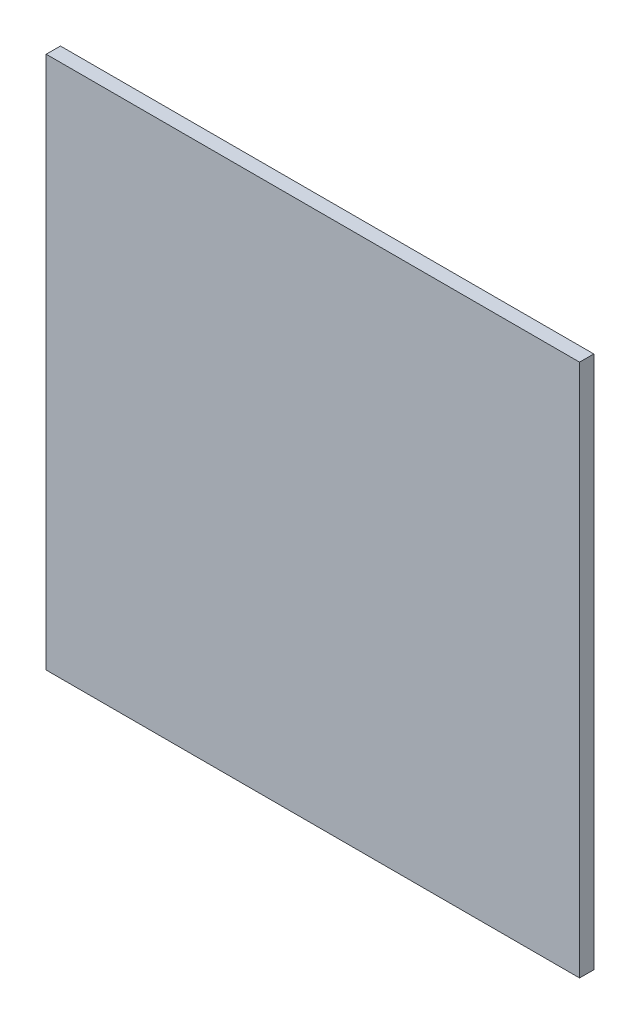
ISO-10303-21;
HEADER;
FILE_DESCRIPTION(('STEP AP214'),'2;1');
FILE_NAME('part.step','',(''),(''),'','','');
FILE_SCHEMA(('AUTOMOTIVE_DESIGN { 1 0 10303 214 1 1 1 1 }'));
ENDSEC;
DATA;
#1=APPLICATION_CONTEXT('core data for automotive mechanical design processes');
#2=APPLICATION_PROTOCOL_DEFINITION('international standard','automotive_design',2000,#1);
#3=PRODUCT_CONTEXT('',#1,'mechanical');
#4=PRODUCT('Part','Part','',(#3));
#5=PRODUCT_RELATED_PRODUCT_CATEGORY('part','',(#4));
#6=PRODUCT_DEFINITION_FORMATION('','',#4);
#7=PRODUCT_DEFINITION_CONTEXT('part definition',#1,'design');
#8=PRODUCT_DEFINITION('design','',#6,#7);
#9=PRODUCT_DEFINITION_SHAPE('','',#8);
#10=(LENGTH_UNIT() NAMED_UNIT(*) SI_UNIT(.MILLI.,.METRE.));
#11=(NAMED_UNIT(*) PLANE_ANGLE_UNIT() SI_UNIT($,.RADIAN.));
#12=(NAMED_UNIT(*) SI_UNIT($,.STERADIAN.) SOLID_ANGLE_UNIT());
#13=UNCERTAINTY_MEASURE_WITH_UNIT(LENGTH_MEASURE(1.E-05),#10,'distance_accuracy_value','');
#14=(GEOMETRIC_REPRESENTATION_CONTEXT(3) GLOBAL_UNCERTAINTY_ASSIGNED_CONTEXT((#13)) GLOBAL_UNIT_ASSIGNED_CONTEXT((#10,
#11,#12)) REPRESENTATION_CONTEXT('',''));
#15=CARTESIAN_POINT('',(0.,0.,0.));
#16=DIRECTION('',(0.,0.,1.));
#17=DIRECTION('',(1.,0.,0.));
#18=AXIS2_PLACEMENT_3D('',#15,#16,#17);
#19=CARTESIAN_POINT('',(15.,-15.,0.8));
#20=DIRECTION('',(-1.,0.,0.));
#21=DIRECTION('',(0.,0.,1.));
#22=AXIS2_PLACEMENT_3D('',#19,#20,#21);
#23=PLANE('',#22);
#24=DIRECTION('',(0.,1.,0.));
#25=VECTOR('',#24,1.);
#26=CARTESIAN_POINT('',(15.,-15.,0.));
#27=LINE('',#26,#25);
#28=CARTESIAN_POINT('',(15.,-15.,0.));
#29=VERTEX_POINT('',#28);
#30=CARTESIAN_POINT('',(15.,15.,0.));
#31=VERTEX_POINT('',#30);
#32=EDGE_CURVE('E100',#29,#31,#27,.T.);
#33=ORIENTED_EDGE('',*,*,#32,.T.);
#34=DIRECTION('',(0.,0.,-1.));
#35=VECTOR('',#34,1.);
#36=CARTESIAN_POINT('',(15.,15.,0.8));
#37=LINE('',#36,#35);
#38=CARTESIAN_POINT('',(15.,15.,0.8));
#39=VERTEX_POINT('',#38);
#40=EDGE_CURVE('E11',#39,#31,#37,.T.);
#41=ORIENTED_EDGE('',*,*,#40,.F.);
#42=DIRECTION('',(0.,1.,0.));
#43=VECTOR('',#42,1.);
#44=CARTESIAN_POINT('',(15.,-15.,0.8));
#45=LINE('',#44,#43);
#46=CARTESIAN_POINT('',(15.,-15.,0.8));
#47=VERTEX_POINT('',#46);
#48=EDGE_CURVE('E88',#47,#39,#45,.T.);
#49=ORIENTED_EDGE('',*,*,#48,.F.);
#50=DIRECTION('',(0.,0.,-1.));
#51=VECTOR('',#50,1.);
#52=CARTESIAN_POINT('',(15.,-15.,0.8));
#53=LINE('',#52,#51);
#54=EDGE_CURVE('E96',#47,#29,#53,.T.);
#55=ORIENTED_EDGE('',*,*,#54,.T.);
#56=EDGE_LOOP('',(#33,#41,#49,#55));
#57=FACE_BOUND('',#56,.T.);
#58=ADVANCED_FACE('F37',(#57),#23,.F.);
#59=CARTESIAN_POINT('',(-15.,15.,0.8));
#60=DIRECTION('',(0.,-1.,0.));
#61=DIRECTION('',(0.,0.,-1.));
#62=AXIS2_PLACEMENT_3D('',#59,#60,#61);
#63=PLANE('',#62);
#64=DIRECTION('',(-1.,0.,0.));
#65=VECTOR('',#64,1.);
#66=CARTESIAN_POINT('',(-15.,15.,0.));
#67=LINE('',#66,#65);
#68=CARTESIAN_POINT('',(-15.,15.,0.));
#69=VERTEX_POINT('',#68);
#70=EDGE_CURVE('E92',#31,#69,#67,.T.);
#71=ORIENTED_EDGE('',*,*,#70,.T.);
#72=DIRECTION('',(0.,0.,-1.));
#73=VECTOR('',#72,1.);
#74=CARTESIAN_POINT('',(-15.,15.,0.8));
#75=LINE('',#74,#73);
#76=CARTESIAN_POINT('',(-15.,15.,0.8));
#77=VERTEX_POINT('',#76);
#78=EDGE_CURVE('E45',#77,#69,#75,.T.);
#79=ORIENTED_EDGE('',*,*,#78,.F.);
#80=DIRECTION('',(-1.,0.,0.));
#81=VECTOR('',#80,1.);
#82=CARTESIAN_POINT('',(-15.,15.,0.8));
#83=LINE('',#82,#81);
#84=EDGE_CURVE('E83',#39,#77,#83,.T.);
#85=ORIENTED_EDGE('',*,*,#84,.F.);
#86=ORIENTED_EDGE('',*,*,#40,.T.);
#87=EDGE_LOOP('',(#71,#79,#85,#86));
#88=FACE_BOUND('',#87,.T.);
#89=ADVANCED_FACE('F91',(#88),#63,.F.);
#90=CARTESIAN_POINT('',(-15.,-15.,0.8));
#91=DIRECTION('',(1.,0.,0.));
#92=DIRECTION('',(0.,0.,-1.));
#93=AXIS2_PLACEMENT_3D('',#90,#91,#92);
#94=PLANE('',#93);
#95=DIRECTION('',(0.,-1.,0.));
#96=VECTOR('',#95,1.);
#97=CARTESIAN_POINT('',(-15.,-15.,0.));
#98=LINE('',#97,#96);
#99=CARTESIAN_POINT('',(-15.,-15.,0.));
#100=VERTEX_POINT('',#99);
#101=EDGE_CURVE('E70',#69,#100,#98,.T.);
#102=ORIENTED_EDGE('',*,*,#101,.T.);
#103=DIRECTION('',(0.,0.,-1.));
#104=VECTOR('',#103,1.);
#105=CARTESIAN_POINT('',(-15.,-15.,0.8));
#106=LINE('',#105,#104);
#107=CARTESIAN_POINT('',(-15.,-15.,0.8));
#108=VERTEX_POINT('',#107);
#109=EDGE_CURVE('E93',#108,#100,#106,.T.);
#110=ORIENTED_EDGE('',*,*,#109,.F.);
#111=DIRECTION('',(0.,-1.,0.));
#112=VECTOR('',#111,1.);
#113=CARTESIAN_POINT('',(-15.,-15.,0.8));
#114=LINE('',#113,#112);
#115=EDGE_CURVE('E86',#77,#108,#114,.T.);
#116=ORIENTED_EDGE('',*,*,#115,.F.);
#117=ORIENTED_EDGE('',*,*,#78,.T.);
#118=EDGE_LOOP('',(#102,#110,#116,#117));
#119=FACE_BOUND('',#118,.T.);
#120=ADVANCED_FACE('F94',(#119),#94,.F.);
#121=CARTESIAN_POINT('',(-15.,-15.,0.8));
#122=DIRECTION('',(0.,1.,0.));
#123=DIRECTION('',(0.,0.,1.));
#124=AXIS2_PLACEMENT_3D('',#121,#122,#123);
#125=PLANE('',#124);
#126=DIRECTION('',(1.,0.,0.));
#127=VECTOR('',#126,1.);
#128=CARTESIAN_POINT('',(-15.,-15.,0.));
#129=LINE('',#128,#127);
#130=EDGE_CURVE('E76',#100,#29,#129,.T.);
#131=ORIENTED_EDGE('',*,*,#130,.T.);
#132=ORIENTED_EDGE('',*,*,#54,.F.);
#133=DIRECTION('',(1.,0.,0.));
#134=VECTOR('',#133,1.);
#135=CARTESIAN_POINT('',(-15.,-15.,0.8));
#136=LINE('',#135,#134);
#137=EDGE_CURVE('E53',#108,#47,#136,.T.);
#138=ORIENTED_EDGE('',*,*,#137,.F.);
#139=ORIENTED_EDGE('',*,*,#109,.T.);
#140=EDGE_LOOP('',(#131,#132,#138,#139));
#141=FACE_BOUND('',#140,.T.);
#142=ADVANCED_FACE('F107',(#141),#125,.F.);
#143=CARTESIAN_POINT('',(0.,0.,0.8));
#144=DIRECTION('',(0.,0.,-1.));
#145=DIRECTION('',(-1.,0.,0.));
#146=AXIS2_PLACEMENT_3D('',#143,#144,#145);
#147=PLANE('',#146);
#148=ORIENTED_EDGE('',*,*,#48,.T.);
#149=ORIENTED_EDGE('',*,*,#84,.T.);
#150=ORIENTED_EDGE('',*,*,#115,.T.);
#151=ORIENTED_EDGE('',*,*,#137,.T.);
#152=EDGE_LOOP('',(#148,#149,#150,#151));
#153=FACE_BOUND('',#152,.T.);
#154=ADVANCED_FACE('F84',(#153),#147,.F.);
#155=CARTESIAN_POINT('',(0.,0.,0.));
#156=DIRECTION('',(0.,0.,-1.));
#157=DIRECTION('',(-1.,0.,0.));
#158=AXIS2_PLACEMENT_3D('',#155,#156,#157);
#159=PLANE('',#158);
#160=ORIENTED_EDGE('',*,*,#32,.F.);
#161=ORIENTED_EDGE('',*,*,#130,.F.);
#162=ORIENTED_EDGE('',*,*,#101,.F.);
#163=ORIENTED_EDGE('',*,*,#70,.F.);
#164=EDGE_LOOP('',(#160,#161,#162,#163));
#165=FACE_BOUND('',#164,.T.);
#166=ADVANCED_FACE('F110',(#165),#159,.T.);
#167=CLOSED_SHELL('',(#58,#89,#120,#142,#154,#166));
#168=MANIFOLD_SOLID_BREP('B2',#167);
#169=ADVANCED_BREP_SHAPE_REPRESENTATION('',(#18,#168),#14);
#170=SHAPE_DEFINITION_REPRESENTATION(#9,#169);
ENDSEC;
END-ISO-10303-21;
